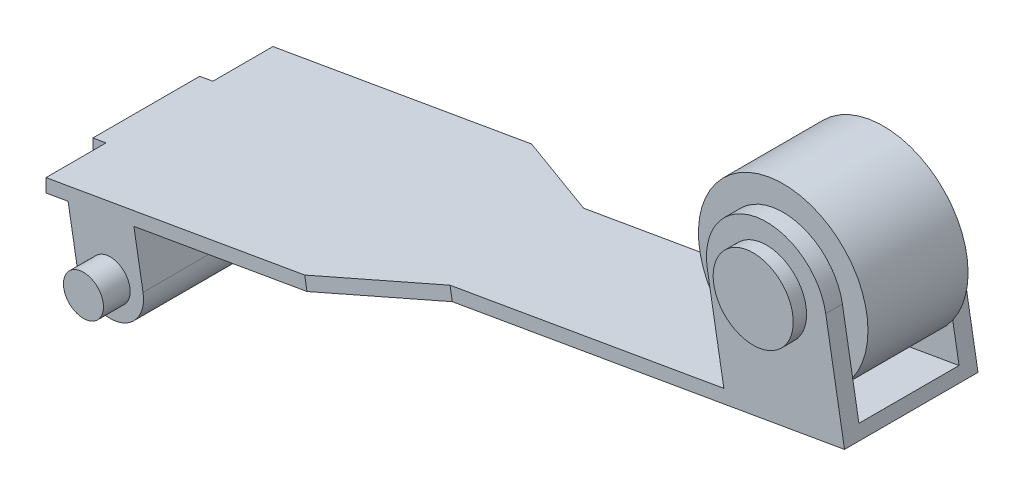
ISO-10303-21;
HEADER;
FILE_DESCRIPTION(('STEP AP214'),'2;1');
FILE_NAME('part.step','',(''),(''),'','','');
FILE_SCHEMA(('AUTOMOTIVE_DESIGN { 1 0 10303 214 1 1 1 1 }'));
ENDSEC;
DATA;
#1=APPLICATION_CONTEXT('core data for automotive mechanical design processes');
#2=APPLICATION_PROTOCOL_DEFINITION('international standard','automotive_design',2000,#1);
#3=PRODUCT_CONTEXT('',#1,'mechanical');
#4=PRODUCT('Part','Part','',(#3));
#5=PRODUCT_RELATED_PRODUCT_CATEGORY('part','',(#4));
#6=PRODUCT_DEFINITION_FORMATION('','',#4);
#7=PRODUCT_DEFINITION_CONTEXT('part definition',#1,'design');
#8=PRODUCT_DEFINITION('design','',#6,#7);
#9=PRODUCT_DEFINITION_SHAPE('','',#8);
#10=(LENGTH_UNIT() NAMED_UNIT(*) SI_UNIT(.MILLI.,.METRE.));
#11=(NAMED_UNIT(*) PLANE_ANGLE_UNIT() SI_UNIT($,.RADIAN.));
#12=(NAMED_UNIT(*) SI_UNIT($,.STERADIAN.) SOLID_ANGLE_UNIT());
#13=UNCERTAINTY_MEASURE_WITH_UNIT(LENGTH_MEASURE(1.E-05),#10,'distance_accuracy_value','');
#14=(GEOMETRIC_REPRESENTATION_CONTEXT(3) GLOBAL_UNCERTAINTY_ASSIGNED_CONTEXT((#13)) GLOBAL_UNIT_ASSIGNED_CONTEXT((#10,
#11,#12)) REPRESENTATION_CONTEXT('',''));
#15=CARTESIAN_POINT('',(0.,0.,0.));
#16=DIRECTION('',(0.,0.,1.));
#17=DIRECTION('',(1.,0.,0.));
#18=AXIS2_PLACEMENT_3D('',#15,#16,#17);
#19=CARTESIAN_POINT('',(0.,0.,-10.5));
#20=DIRECTION('',(0.,0.,1.));
#21=DIRECTION('',(1.,0.,0.));
#22=AXIS2_PLACEMENT_3D('',#19,#20,#21);
#23=PLANE('',#22);
#24=CARTESIAN_POINT('',(0.,0.,-10.5));
#25=DIRECTION('',(0.,0.,-1.));
#26=DIRECTION('',(-1.,0.,0.));
#27=AXIS2_PLACEMENT_3D('',#24,#25,#26);
#28=CIRCLE('',#27,1.5);
#29=CARTESIAN_POINT('',(-1.5,0.,-10.5));
#30=VERTEX_POINT('',#29);
#31=EDGE_CURVE('E20',#30,#30,#28,.F.);
#32=ORIENTED_EDGE('',*,*,#31,.F.);
#33=EDGE_LOOP('',(#32));
#34=FACE_BOUND('',#33,.T.);
#35=ADVANCED_FACE('F17',(#34),#23,.F.);
#36=CARTESIAN_POINT('',(45.6714079047275,20.35,-6.));
#37=DIRECTION('',(0.,0.,-1.));
#38=DIRECTION('',(-1.,0.,0.));
#39=AXIS2_PLACEMENT_3D('',#36,#37,#38);
#40=PLANE('',#39);
#41=CARTESIAN_POINT('',(45.6714079047275,20.35,-6.));
#42=DIRECTION('',(0.,0.,1.));
#43=DIRECTION('',(1.,0.,0.));
#44=AXIS2_PLACEMENT_3D('',#41,#42,#43);
#45=CIRCLE('',#44,1.25);
#46=CARTESIAN_POINT('',(46.9214079047275,20.35,-6.));
#47=VERTEX_POINT('',#46);
#48=EDGE_CURVE('E153',#47,#47,#45,.T.);
#49=ORIENTED_EDGE('',*,*,#48,.F.);
#50=EDGE_LOOP('',(#49));
#51=FACE_BOUND('',#50,.T.);
#52=ADVANCED_FACE('F367',(#51),#40,.T.);
#53=CARTESIAN_POINT('',(45.6714079047275,20.35,6.));
#54=DIRECTION('',(0.,0.,1.));
#55=DIRECTION('',(1.,0.,0.));
#56=AXIS2_PLACEMENT_3D('',#53,#54,#55);
#57=PLANE('',#56);
#58=CARTESIAN_POINT('',(45.6714079047275,20.35,6.));
#59=DIRECTION('',(0.,0.,-1.));
#60=DIRECTION('',(-1.,0.,0.));
#61=AXIS2_PLACEMENT_3D('',#58,#59,#60);
#62=CIRCLE('',#61,3.);
#63=CARTESIAN_POINT('',(42.6714079047275,20.35,6.));
#64=VERTEX_POINT('',#63);
#65=EDGE_CURVE('E351',#64,#64,#62,.T.);
#66=ORIENTED_EDGE('',*,*,#65,.F.);
#67=EDGE_LOOP('',(#66));
#68=FACE_BOUND('',#67,.T.);
#69=ADVANCED_FACE('F369',(#68),#57,.T.);
#70=CARTESIAN_POINT('',(0.,0.,10.5));
#71=DIRECTION('',(0.,0.,1.));
#72=DIRECTION('',(1.,0.,0.));
#73=AXIS2_PLACEMENT_3D('',#70,#71,#72);
#74=PLANE('',#73);
#75=CARTESIAN_POINT('',(0.,0.,10.5));
#76=DIRECTION('',(0.,0.,-1.));
#77=DIRECTION('',(-1.,0.,0.));
#78=AXIS2_PLACEMENT_3D('',#75,#76,#77);
#79=CIRCLE('',#78,1.5);
#80=CARTESIAN_POINT('',(-1.5,0.,10.5));
#81=VERTEX_POINT('',#80);
#82=EDGE_CURVE('E259',#81,#81,#79,.T.);
#83=ORIENTED_EDGE('',*,*,#82,.F.);
#84=EDGE_LOOP('',(#83));
#85=FACE_BOUND('',#84,.T.);
#86=ADVANCED_FACE('F375',(#85),#74,.T.);
#87=CARTESIAN_POINT('',(-4.80556120340105,-3.93121848760159,4.));
#88=DIRECTION('',(-1.,0.,0.));
#89=DIRECTION('',(0.,-1.,0.));
#90=AXIS2_PLACEMENT_3D('',#87,#88,#89);
#91=PLANE('',#90);
#92=DIRECTION('',(0.,1.,0.));
#93=VECTOR('',#92,1.);
#94=CARTESIAN_POINT('',(-4.80556120340105,-3.93121848760159,4.));
#95=LINE('',#94,#93);
#96=CARTESIAN_POINT('',(-4.80556120340105,3.23995160209072,4.));
#97=VERTEX_POINT('',#96);
#98=CARTESIAN_POINT('',(-4.80556120340105,-3.93121848760159,4.));
#99=VERTEX_POINT('',#98);
#100=EDGE_CURVE('E292',#97,#99,#95,.F.);
#101=ORIENTED_EDGE('',*,*,#100,.T.);
#102=DIRECTION('',(0.,0.,1.));
#103=VECTOR('',#102,1.);
#104=CARTESIAN_POINT('',(-4.80556120340105,-3.93121848760159,4.));
#105=LINE('',#104,#103);
#106=CARTESIAN_POINT('',(-4.80556120340105,-3.93121848760159,-4.));
#107=VERTEX_POINT('',#106);
#108=EDGE_CURVE('E269',#99,#107,#105,.F.);
#109=ORIENTED_EDGE('',*,*,#108,.T.);
#110=DIRECTION('',(0.,1.,0.));
#111=VECTOR('',#110,1.);
#112=CARTESIAN_POINT('',(-4.80556120340105,-3.93121848760159,-4.));
#113=LINE('',#112,#111);
#114=CARTESIAN_POINT('',(-4.80556120340105,3.23995160209072,-4.));
#115=VERTEX_POINT('',#114);
#116=EDGE_CURVE('E266',#115,#107,#113,.F.);
#117=ORIENTED_EDGE('',*,*,#116,.F.);
#118=DIRECTION('',(0.,0.,1.));
#119=VECTOR('',#118,1.);
#120=CARTESIAN_POINT('',(-4.80556120340105,3.23995160209072,8.5));
#121=LINE('',#120,#119);
#122=EDGE_CURVE('E255',#115,#97,#121,.T.);
#123=ORIENTED_EDGE('',*,*,#122,.T.);
#124=EDGE_LOOP('',(#101,#109,#117,#123));
#125=FACE_BOUND('',#124,.T.);
#126=ADVANCED_FACE('F500',(#125),#91,.F.);
#127=CARTESIAN_POINT('',(0.,0.,10.5));
#128=DIRECTION('',(0.,0.,-1.));
#129=DIRECTION('',(-1.,0.,0.));
#130=AXIS2_PLACEMENT_3D('',#127,#128,#129);
#131=CYLINDRICAL_SURFACE('',#130,1.5);
#132=CARTESIAN_POINT('',(0.,0.,-8.5));
#133=DIRECTION('',(0.,0.,-1.));
#134=DIRECTION('',(-1.,0.,0.));
#135=AXIS2_PLACEMENT_3D('',#132,#133,#134);
#136=CIRCLE('',#135,1.5);
#137=CARTESIAN_POINT('',(-1.5,0.,-8.5));
#138=VERTEX_POINT('',#137);
#139=EDGE_CURVE('E219',#138,#138,#136,.T.);
#140=ORIENTED_EDGE('',*,*,#139,.T.);
#141=EDGE_LOOP('',(#140));
#142=FACE_BOUND('',#141,.T.);
#143=ORIENTED_EDGE('',*,*,#31,.T.);
#144=EDGE_LOOP('',(#143));
#145=FACE_BOUND('',#144,.T.);
#146=ADVANCED_FACE('F497',(#142,#145),#131,.T.);
#147=CARTESIAN_POINT('',(45.6714079047275,20.35,8.5));
#148=DIRECTION('',(0.,0.,-1.));
#149=DIRECTION('',(-1.,0.,0.));
#150=AXIS2_PLACEMENT_3D('',#147,#148,#149);
#151=CYLINDRICAL_SURFACE('',#150,4.4999999999999);
#152=CARTESIAN_POINT('',(45.6714079047275,20.35,-5.));
#153=DIRECTION('',(0.,0.,-1.));
#154=DIRECTION('',(-1.,0.,0.));
#155=AXIS2_PLACEMENT_3D('',#152,#153,#154);
#156=CIRCLE('',#155,4.4999999999999);
#157=CARTESIAN_POINT('',(50.1049839783841,21.1203266833618,-5.));
#158=VERTEX_POINT('',#157);
#159=CARTESIAN_POINT('',(41.237831831071,19.5796733166382,-5.));
#160=VERTEX_POINT('',#159);
#161=EDGE_CURVE('E147',#158,#160,#156,.F.);
#162=ORIENTED_EDGE('',*,*,#161,.T.);
#163=DIRECTION('',(0.,0.,1.));
#164=VECTOR('',#163,1.);
#165=CARTESIAN_POINT('',(41.237831831071,19.5796733166382,8.5));
#166=LINE('',#165,#164);
#167=CARTESIAN_POINT('',(41.2378318310709,19.5796733166382,-3.75));
#168=VERTEX_POINT('',#167);
#169=EDGE_CURVE('E141',#160,#168,#166,.T.);
#170=ORIENTED_EDGE('',*,*,#169,.T.);
#171=CARTESIAN_POINT('',(45.6714079047275,20.35,-3.75));
#172=DIRECTION('',(0.,0.,-1.));
#173=DIRECTION('',(-1.,0.,0.));
#174=AXIS2_PLACEMENT_3D('',#171,#172,#173);
#175=CIRCLE('',#174,4.4999999999999);
#176=CARTESIAN_POINT('',(50.1049839783841,21.1203266833618,-3.75));
#177=VERTEX_POINT('',#176);
#178=EDGE_CURVE('E145',#177,#168,#175,.F.);
#179=ORIENTED_EDGE('',*,*,#178,.F.);
#180=DIRECTION('',(0.,0.,-1.));
#181=VECTOR('',#180,1.);
#182=CARTESIAN_POINT('',(50.104983978384,21.1203266833618,8.5));
#183=LINE('',#182,#181);
#184=EDGE_CURVE('E215',#177,#158,#183,.T.);
#185=ORIENTED_EDGE('',*,*,#184,.T.);
#186=EDGE_LOOP('',(#162,#170,#179,#185));
#187=FACE_BOUND('',#186,.T.);
#188=ADVANCED_FACE('F143',(#187),#151,.T.);
#189=CARTESIAN_POINT('',(45.6714079047275,20.35,-6.));
#190=DIRECTION('',(0.,0.,1.));
#191=DIRECTION('',(1.,0.,0.));
#192=AXIS2_PLACEMENT_3D('',#189,#190,#191);
#193=CYLINDRICAL_SURFACE('',#192,1.25);
#194=ORIENTED_EDGE('',*,*,#48,.T.);
#195=EDGE_LOOP('',(#194));
#196=FACE_BOUND('',#195,.T.);
#197=CARTESIAN_POINT('',(45.6714079047275,20.35,-5.));
#198=DIRECTION('',(0.,0.,1.));
#199=DIRECTION('',(1.,0.,0.));
#200=AXIS2_PLACEMENT_3D('',#197,#198,#199);
#201=CIRCLE('',#200,1.25);
#202=CARTESIAN_POINT('',(46.9214079047275,20.35,-5.));
#203=VERTEX_POINT('',#202);
#204=EDGE_CURVE('E339',#203,#203,#201,.F.);
#205=ORIENTED_EDGE('',*,*,#204,.T.);
#206=EDGE_LOOP('',(#205));
#207=FACE_BOUND('',#206,.T.);
#208=ADVANCED_FACE('F364',(#196,#207),#193,.T.);
#209=CARTESIAN_POINT('',(41.237831831071,19.5796733166382,8.5));
#210=DIRECTION('',(0.98523912747926,0.171183707413721,0.));
#211=DIRECTION('',(-0.171183707413721,0.98523912747926,0.));
#212=AXIS2_PLACEMENT_3D('',#209,#210,#211);
#213=PLANE('',#212);
#214=DIRECTION('',(-0.171183707413718,0.985239127479261,0.));
#215=VECTOR('',#214,1.);
#216=CARTESIAN_POINT('',(42.4757323147578,12.455,-3.75));
#217=LINE('',#216,#215);
#218=CARTESIAN_POINT('',(42.4757323147578,12.455,-3.75));
#219=VERTEX_POINT('',#218);
#220=CARTESIAN_POINT('',(42.0047749604165,15.1655711161504,-3.75));
#221=VERTEX_POINT('',#220);
#222=EDGE_CURVE('E168',#219,#221,#217,.T.);
#223=ORIENTED_EDGE('',*,*,#222,.T.);
#224=DIRECTION('',(0.171183707413745,-0.985239127479256,0.));
#225=VECTOR('',#224,1.);
#226=CARTESIAN_POINT('',(41.2378318310709,19.5796733166382,-3.75));
#227=LINE('',#226,#225);
#228=EDGE_CURVE('E159',#168,#221,#227,.T.);
#229=ORIENTED_EDGE('',*,*,#228,.F.);
#230=ORIENTED_EDGE('',*,*,#169,.F.);
#231=DIRECTION('',(0.171183707413722,-0.98523912747926,0.));
#232=VECTOR('',#231,1.);
#233=CARTESIAN_POINT('',(41.237831831071,19.5796733166382,-5.));
#234=LINE('',#233,#232);
#235=CARTESIAN_POINT('',(42.4757323147578,12.455,-5.));
#236=VERTEX_POINT('',#235);
#237=EDGE_CURVE('E196',#160,#236,#234,.T.);
#238=ORIENTED_EDGE('',*,*,#237,.T.);
#239=DIRECTION('',(0.,0.,1.));
#240=VECTOR('',#239,1.);
#241=CARTESIAN_POINT('',(42.4757323147578,12.455,8.5));
#242=LINE('',#241,#240);
#243=EDGE_CURVE('E152',#219,#236,#242,.F.);
#244=ORIENTED_EDGE('',*,*,#243,.F.);
#245=EDGE_LOOP('',(#223,#229,#230,#238,#244));
#246=FACE_BOUND('',#245,.T.);
#247=ADVANCED_FACE('F166',(#246),#213,.F.);
#248=CARTESIAN_POINT('',(-7.15438144835975,3.83184787745565,-3.75));
#249=DIRECTION('',(0.,0.,-1.));
#250=DIRECTION('',(-1.,0.,0.));
#251=AXIS2_PLACEMENT_3D('',#248,#249,#250);
#252=PLANE('',#251);
#253=DIRECTION('',(0.171183707413747,-0.985239127479256,0.));
#254=VECTOR('',#253,1.);
#255=CARTESIAN_POINT('',(51.5140681694848,13.0104142392446,-3.75000000000001));
#256=LINE('',#255,#254);
#257=CARTESIAN_POINT('',(50.8719271077297,16.7062244828742,-3.75));
#258=VERTEX_POINT('',#257);
#259=EDGE_CURVE('E162',#258,#177,#256,.F.);
#260=ORIENTED_EDGE('',*,*,#259,.T.);
#261=ORIENTED_EDGE('',*,*,#178,.T.);
#262=ORIENTED_EDGE('',*,*,#228,.T.);
#263=CARTESIAN_POINT('',(45.6714079047275,20.35,-3.75));
#264=DIRECTION('',(0.,0.,1.));
#265=DIRECTION('',(1.,0.,0.));
#266=AXIS2_PLACEMENT_3D('',#263,#264,#265);
#267=CIRCLE('',#266,6.35);
#268=EDGE_CURVE('E163',#258,#221,#267,.T.);
#269=ORIENTED_EDGE('',*,*,#268,.F.);
#270=EDGE_LOOP('',(#260,#261,#262,#269));
#271=FACE_BOUND('',#270,.T.);
#272=ADVANCED_FACE('F158',(#271),#252,.T.);
#273=CARTESIAN_POINT('',(-7.15438144835975,3.83184787745565,3.75));
#274=DIRECTION('',(0.,0.,1.));
#275=DIRECTION('',(1.,0.,0.));
#276=AXIS2_PLACEMENT_3D('',#273,#274,#275);
#277=PLANE('',#276);
#278=DIRECTION('',(0.171183707413747,-0.985239127479256,0.));
#279=VECTOR('',#278,1.);
#280=CARTESIAN_POINT('',(51.5140681694848,13.0104142392446,3.75));
#281=LINE('',#280,#279);
#282=CARTESIAN_POINT('',(50.1049839783841,21.1203266833618,3.75));
#283=VERTEX_POINT('',#282);
#284=CARTESIAN_POINT('',(50.8719271077297,16.7062244828742,3.75));
#285=VERTEX_POINT('',#284);
#286=EDGE_CURVE('E791',#283,#285,#281,.T.);
#287=ORIENTED_EDGE('',*,*,#286,.T.);
#288=CARTESIAN_POINT('',(45.6714079047275,20.35,3.75));
#289=DIRECTION('',(0.,0.,1.));
#290=DIRECTION('',(1.,0.,0.));
#291=AXIS2_PLACEMENT_3D('',#288,#289,#290);
#292=CIRCLE('',#291,6.35);
#293=CARTESIAN_POINT('',(42.0047749604165,15.1655711161504,3.75));
#294=VERTEX_POINT('',#293);
#295=EDGE_CURVE('E359',#294,#285,#292,.F.);
#296=ORIENTED_EDGE('',*,*,#295,.F.);
#297=DIRECTION('',(-0.171183707413721,0.98523912747926,0.));
#298=VECTOR('',#297,1.);
#299=CARTESIAN_POINT('',(41.237831831071,19.5796733166382,3.75));
#300=LINE('',#299,#298);
#301=CARTESIAN_POINT('',(41.237831831071,19.5796733166382,3.75));
#302=VERTEX_POINT('',#301);
#303=EDGE_CURVE('E835',#294,#302,#300,.T.);
#304=ORIENTED_EDGE('',*,*,#303,.T.);
#305=CARTESIAN_POINT('',(45.6714079047275,20.35,3.75));
#306=DIRECTION('',(0.,0.,-1.));
#307=DIRECTION('',(-1.,0.,0.));
#308=AXIS2_PLACEMENT_3D('',#305,#306,#307);
#309=CIRCLE('',#308,4.4999999999999);
#310=EDGE_CURVE('E356',#283,#302,#309,.F.);
#311=ORIENTED_EDGE('',*,*,#310,.F.);
#312=EDGE_LOOP('',(#287,#296,#304,#311));
#313=FACE_BOUND('',#312,.T.);
#314=ADVANCED_FACE('F484',(#313),#277,.T.);
#315=CARTESIAN_POINT('',(45.6714079047275,20.35,-21.7105122421383));
#316=DIRECTION('',(0.,0.,1.));
#317=DIRECTION('',(1.,0.,0.));
#318=AXIS2_PLACEMENT_3D('',#315,#316,#317);
#319=CYLINDRICAL_SURFACE('',#318,6.35);
#320=ORIENTED_EDGE('',*,*,#268,.T.);
#321=CARTESIAN_POINT('',(45.6714079047275,20.35,-3.75));
#322=DIRECTION('',(0.,0.,1.));
#323=DIRECTION('',(1.,0.,0.));
#324=AXIS2_PLACEMENT_3D('',#321,#322,#323);
#325=CIRCLE('',#324,6.35);
#326=EDGE_CURVE('E178',#221,#258,#325,.T.);
#327=ORIENTED_EDGE('',*,*,#326,.T.);
#328=EDGE_LOOP('',(#320,#327));
#329=FACE_BOUND('',#328,.T.);
#330=CARTESIAN_POINT('',(45.6714079047275,20.35,3.75));
#331=DIRECTION('',(0.,0.,1.));
#332=DIRECTION('',(1.,0.,0.));
#333=AXIS2_PLACEMENT_3D('',#330,#331,#332);
#334=CIRCLE('',#333,6.35);
#335=EDGE_CURVE('E333',#285,#294,#334,.F.);
#336=ORIENTED_EDGE('',*,*,#335,.T.);
#337=ORIENTED_EDGE('',*,*,#295,.T.);
#338=EDGE_LOOP('',(#336,#337));
#339=FACE_BOUND('',#338,.T.);
#340=ADVANCED_FACE('F480',(#329,#339),#319,.T.);
#341=CARTESIAN_POINT('',(45.6714079047275,20.35,8.5));
#342=DIRECTION('',(0.,0.,-1.));
#343=DIRECTION('',(-1.,0.,0.));
#344=AXIS2_PLACEMENT_3D('',#341,#342,#343);
#345=CYLINDRICAL_SURFACE('',#344,4.4999999999999);
#346=DIRECTION('',(0.,0.,1.));
#347=VECTOR('',#346,1.);
#348=CARTESIAN_POINT('',(50.1049839783841,21.1203266833619,8.5));
#349=LINE('',#348,#347);
#350=CARTESIAN_POINT('',(50.1049839783841,21.1203266833618,5.));
#351=VERTEX_POINT('',#350);
#352=EDGE_CURVE('E844',#351,#283,#349,.F.);
#353=ORIENTED_EDGE('',*,*,#352,.T.);
#354=ORIENTED_EDGE('',*,*,#310,.T.);
#355=DIRECTION('',(0.,0.,1.));
#356=VECTOR('',#355,1.);
#357=CARTESIAN_POINT('',(41.237831831071,19.5796733166382,8.5));
#358=LINE('',#357,#356);
#359=CARTESIAN_POINT('',(41.237831831071,19.5796733166382,5.));
#360=VERTEX_POINT('',#359);
#361=EDGE_CURVE('E355',#302,#360,#358,.T.);
#362=ORIENTED_EDGE('',*,*,#361,.T.);
#363=CARTESIAN_POINT('',(45.6714079047275,20.35,5.));
#364=DIRECTION('',(0.,0.,-1.));
#365=DIRECTION('',(-1.,0.,0.));
#366=AXIS2_PLACEMENT_3D('',#363,#364,#365);
#367=CIRCLE('',#366,4.4999999999999);
#368=EDGE_CURVE('E328',#360,#351,#367,.T.);
#369=ORIENTED_EDGE('',*,*,#368,.T.);
#370=EDGE_LOOP('',(#353,#354,#362,#369));
#371=FACE_BOUND('',#370,.T.);
#372=ADVANCED_FACE('F476',(#371),#345,.T.);
#373=CARTESIAN_POINT('',(41.237831831071,19.5796733166382,8.5));
#374=DIRECTION('',(0.98523912747926,0.171183707413721,0.));
#375=DIRECTION('',(-0.171183707413721,0.98523912747926,0.));
#376=AXIS2_PLACEMENT_3D('',#373,#374,#375);
#377=PLANE('',#376);
#378=ORIENTED_EDGE('',*,*,#303,.F.);
#379=DIRECTION('',(0.171183707413718,-0.985239127479261,0.));
#380=VECTOR('',#379,1.);
#381=CARTESIAN_POINT('',(42.0047749604165,15.1655711161504,3.75));
#382=LINE('',#381,#380);
#383=CARTESIAN_POINT('',(42.4757323147578,12.455,3.75));
#384=VERTEX_POINT('',#383);
#385=EDGE_CURVE('E332',#294,#384,#382,.T.);
#386=ORIENTED_EDGE('',*,*,#385,.T.);
#387=DIRECTION('',(0.,0.,1.));
#388=VECTOR('',#387,1.);
#389=CARTESIAN_POINT('',(42.4757323147578,12.455,8.5));
#390=LINE('',#389,#388);
#391=CARTESIAN_POINT('',(42.4757323147578,12.455,5.));
#392=VERTEX_POINT('',#391);
#393=EDGE_CURVE('E358',#392,#384,#390,.F.);
#394=ORIENTED_EDGE('',*,*,#393,.F.);
#395=DIRECTION('',(-0.171183707413722,0.98523912747926,0.));
#396=VECTOR('',#395,1.);
#397=CARTESIAN_POINT('',(42.4757323147578,12.455,5.));
#398=LINE('',#397,#396);
#399=EDGE_CURVE('E327',#392,#360,#398,.T.);
#400=ORIENTED_EDGE('',*,*,#399,.T.);
#401=ORIENTED_EDGE('',*,*,#361,.F.);
#402=EDGE_LOOP('',(#378,#386,#394,#400,#401));
#403=FACE_BOUND('',#402,.T.);
#404=ADVANCED_FACE('F472',(#403),#377,.F.);
#405=CARTESIAN_POINT('',(45.6714079047275,20.35,6.));
#406=DIRECTION('',(0.,0.,-1.));
#407=DIRECTION('',(-1.,0.,0.));
#408=AXIS2_PLACEMENT_3D('',#405,#406,#407);
#409=CYLINDRICAL_SURFACE('',#408,3.);
#410=ORIENTED_EDGE('',*,*,#65,.T.);
#411=EDGE_LOOP('',(#410));
#412=FACE_BOUND('',#411,.T.);
#413=CARTESIAN_POINT('',(45.6714079047275,20.35,5.));
#414=DIRECTION('',(0.,0.,-1.));
#415=DIRECTION('',(-1.,0.,0.));
#416=AXIS2_PLACEMENT_3D('',#413,#414,#415);
#417=CIRCLE('',#416,3.);
#418=CARTESIAN_POINT('',(42.6714079047275,20.35,5.));
#419=VERTEX_POINT('',#418);
#420=EDGE_CURVE('E323',#419,#419,#417,.F.);
#421=ORIENTED_EDGE('',*,*,#420,.T.);
#422=EDGE_LOOP('',(#421));
#423=FACE_BOUND('',#422,.T.);
#424=ADVANCED_FACE('F468',(#412,#423),#409,.T.);
#425=CARTESIAN_POINT('',(-2.46309781869814,-0.427959268534373,8.5));
#426=DIRECTION('',(0.985239127479255,0.171183707413749,0.));
#427=DIRECTION('',(-0.171183707413749,0.985239127479255,0.));
#428=AXIS2_PLACEMENT_3D('',#425,#426,#427);
#429=PLANE('',#428);
#430=DIRECTION('',(0.,0.,-1.));
#431=VECTOR('',#430,1.);
#432=CARTESIAN_POINT('',(-2.46309781869814,-0.427959268534373,8.5));
#433=LINE('',#432,#431);
#434=CARTESIAN_POINT('',(-2.46309781869814,-0.42795926853437,8.5));
#435=VERTEX_POINT('',#434);
#436=CARTESIAN_POINT('',(-2.46309781869814,-0.42795926853437,-8.5));
#437=VERTEX_POINT('',#436);
#438=EDGE_CURVE('E354',#435,#437,#433,.T.);
#439=ORIENTED_EDGE('',*,*,#438,.F.);
#440=DIRECTION('',(0.171183707413747,-0.985239127479256,0.));
#441=VECTOR('',#440,1.);
#442=CARTESIAN_POINT('',(-3.15035946923589,3.52754023054582,8.5));
#443=LINE('',#442,#441);
#444=CARTESIAN_POINT('',(-3.15035946923589,3.52754023054582,8.5));
#445=VERTEX_POINT('',#444);
#446=EDGE_CURVE('E322',#445,#435,#443,.T.);
#447=ORIENTED_EDGE('',*,*,#446,.F.);
#448=DIRECTION('',(0.,0.,1.));
#449=VECTOR('',#448,1.);
#450=CARTESIAN_POINT('',(-3.1503594692359,3.52754023054582,8.5));
#451=LINE('',#450,#449);
#452=CARTESIAN_POINT('',(-3.15035946923589,3.52754023054582,-8.5));
#453=VERTEX_POINT('',#452);
#454=EDGE_CURVE('E258',#445,#453,#451,.F.);
#455=ORIENTED_EDGE('',*,*,#454,.T.);
#456=DIRECTION('',(0.171183707413747,-0.985239127479256,0.));
#457=VECTOR('',#456,1.);
#458=CARTESIAN_POINT('',(-3.15035946923589,3.52754023054582,-8.5));
#459=LINE('',#458,#457);
#460=EDGE_CURVE('E236',#453,#437,#459,.T.);
#461=ORIENTED_EDGE('',*,*,#460,.T.);
#462=EDGE_LOOP('',(#439,#447,#455,#461));
#463=FACE_BOUND('',#462,.T.);
#464=ADVANCED_FACE('F464',(#463),#429,.F.);
#465=CARTESIAN_POINT('',(0.,0.,8.5));
#466=DIRECTION('',(0.,0.,-1.));
#467=DIRECTION('',(-1.,0.,0.));
#468=AXIS2_PLACEMENT_3D('',#465,#466,#467);
#469=CYLINDRICAL_SURFACE('',#468,2.5);
#470=CARTESIAN_POINT('',(0.,0.,8.5));
#471=DIRECTION('',(0.,0.,-1.));
#472=DIRECTION('',(-1.,0.,0.));
#473=AXIS2_PLACEMENT_3D('',#470,#471,#472);
#474=CIRCLE('',#473,2.5);
#475=CARTESIAN_POINT('',(2.46309781869814,0.427959268534373,8.5));
#476=VERTEX_POINT('',#475);
#477=EDGE_CURVE('E319',#435,#476,#474,.F.);
#478=ORIENTED_EDGE('',*,*,#477,.F.);
#479=ORIENTED_EDGE('',*,*,#438,.T.);
#480=CARTESIAN_POINT('',(0.,0.,-8.5));
#481=DIRECTION('',(0.,0.,-1.));
#482=DIRECTION('',(-1.,0.,0.));
#483=AXIS2_PLACEMENT_3D('',#480,#481,#482);
#484=CIRCLE('',#483,2.5);
#485=CARTESIAN_POINT('',(2.46309781869814,0.427959268534373,-8.5));
#486=VERTEX_POINT('',#485);
#487=EDGE_CURVE('E345',#437,#486,#484,.F.);
#488=ORIENTED_EDGE('',*,*,#487,.T.);
#489=DIRECTION('',(0.,0.,1.));
#490=VECTOR('',#489,1.);
#491=CARTESIAN_POINT('',(2.46309781869814,0.427959268534372,8.5));
#492=LINE('',#491,#490);
#493=EDGE_CURVE('E808',#486,#476,#492,.T.);
#494=ORIENTED_EDGE('',*,*,#493,.T.);
#495=EDGE_LOOP('',(#478,#479,#488,#494));
#496=FACE_BOUND('',#495,.T.);
#497=ADVANCED_FACE('F460',(#496),#469,.T.);
#498=CARTESIAN_POINT('',(1.77836298904314,4.36891577845138,8.5));
#499=DIRECTION('',(-0.985239127479255,-0.171183707413749,0.));
#500=DIRECTION('',(0.171183707413749,-0.985239127479255,0.));
#501=AXIS2_PLACEMENT_3D('',#498,#499,#500);
#502=PLANE('',#501);
#503=DIRECTION('',(0.,0.,1.));
#504=VECTOR('',#503,1.);
#505=CARTESIAN_POINT('',(1.77836298904314,4.36891577845138,8.5));
#506=LINE('',#505,#504);
#507=CARTESIAN_POINT('',(1.77836298904314,4.36891577845138,-8.5));
#508=VERTEX_POINT('',#507);
#509=CARTESIAN_POINT('',(1.77836298904314,4.36891577845138,8.5));
#510=VERTEX_POINT('',#509);
#511=EDGE_CURVE('E350',#508,#510,#506,.T.);
#512=ORIENTED_EDGE('',*,*,#511,.T.);
#513=DIRECTION('',(-0.17118370741375,0.985239127479255,0.));
#514=VECTOR('',#513,1.);
#515=CARTESIAN_POINT('',(2.46309781869814,0.42795926853437,8.5));
#516=LINE('',#515,#514);
#517=EDGE_CURVE('E321',#476,#510,#516,.T.);
#518=ORIENTED_EDGE('',*,*,#517,.F.);
#519=ORIENTED_EDGE('',*,*,#493,.F.);
#520=DIRECTION('',(-0.17118370741375,0.985239127479255,0.));
#521=VECTOR('',#520,1.);
#522=CARTESIAN_POINT('',(2.46309781869814,0.42795926853437,-8.5));
#523=LINE('',#522,#521);
#524=EDGE_CURVE('E225',#486,#508,#523,.T.);
#525=ORIENTED_EDGE('',*,*,#524,.T.);
#526=EDGE_LOOP('',(#512,#518,#519,#525));
#527=FACE_BOUND('',#526,.T.);
#528=ADVANCED_FACE('F456',(#527),#502,.F.);
#529=CARTESIAN_POINT('',(1.77836298904314,4.36891577845138,8.5));
#530=DIRECTION('',(-0.171183707413749,0.985239127479255,0.));
#531=DIRECTION('',(-0.985239127479255,-0.171183707413749,0.));
#532=AXIS2_PLACEMENT_3D('',#529,#530,#531);
#533=PLANE('',#532);
#534=DIRECTION('',(0.985239127479255,0.171183707413749,0.));
#535=VECTOR('',#534,1.);
#536=CARTESIAN_POINT('',(22.1342373880535,7.90571608416657,-5.));
#537=LINE('',#536,#535);
#538=CARTESIAN_POINT('',(22.1342373880535,7.90571608416657,-5.));
#539=VERTEX_POINT('',#538);
#540=CARTESIAN_POINT('',(51.5140681694848,13.0104142392446,-5.00000000000001));
#541=VERTEX_POINT('',#540);
#542=EDGE_CURVE('E195',#539,#541,#537,.T.);
#543=ORIENTED_EDGE('',*,*,#542,.T.);
#544=DIRECTION('',(0.,0.,1.));
#545=VECTOR('',#544,1.);
#546=CARTESIAN_POINT('',(51.5140681694848,13.0104142392446,8.5));
#547=LINE('',#546,#545);
#548=CARTESIAN_POINT('',(51.5140681694848,13.0104142392446,5.));
#549=VERTEX_POINT('',#548);
#550=EDGE_CURVE('E847',#541,#549,#547,.T.);
#551=ORIENTED_EDGE('',*,*,#550,.T.);
#552=DIRECTION('',(-0.985239127479255,-0.171183707413749,0.));
#553=VECTOR('',#552,1.);
#554=CARTESIAN_POINT('',(51.5140681694848,13.0104142392446,5.));
#555=LINE('',#554,#553);
#556=CARTESIAN_POINT('',(22.1342373880535,7.90571608416657,5.));
#557=VERTEX_POINT('',#556);
#558=EDGE_CURVE('E778',#549,#557,#555,.T.);
#559=ORIENTED_EDGE('',*,*,#558,.T.);
#560=DIRECTION('',(-0.892807086185347,-0.155123789500221,0.422885465331124));
#561=VECTOR('',#560,1.);
#562=CARTESIAN_POINT('',(22.1342373880535,7.90571608416657,4.99999999999999));
#563=LINE('',#562,#561);
#564=CARTESIAN_POINT('',(14.744943931959,6.62183827856345,8.5));
#565=VERTEX_POINT('',#564);
#566=EDGE_CURVE('E771',#557,#565,#563,.T.);
#567=ORIENTED_EDGE('',*,*,#566,.T.);
#568=DIRECTION('',(0.985239127479255,0.171183707413749,0.));
#569=VECTOR('',#568,1.);
#570=CARTESIAN_POINT('',(1.77836298904314,4.36891577845138,8.5));
#571=LINE('',#570,#569);
#572=EDGE_CURVE('E318',#510,#565,#571,.T.);
#573=ORIENTED_EDGE('',*,*,#572,.F.);
#574=ORIENTED_EDGE('',*,*,#511,.F.);
#575=DIRECTION('',(0.985239127479255,0.171183707413749,0.));
#576=VECTOR('',#575,1.);
#577=CARTESIAN_POINT('',(1.77836298904314,4.36891577845138,-8.5));
#578=LINE('',#577,#576);
#579=CARTESIAN_POINT('',(14.744943931959,6.62183827856346,-8.50000000000001));
#580=VERTEX_POINT('',#579);
#581=EDGE_CURVE('E222',#508,#580,#578,.T.);
#582=ORIENTED_EDGE('',*,*,#581,.T.);
#583=DIRECTION('',(0.892807086185347,0.15512378950022,0.422885465331124));
#584=VECTOR('',#583,1.);
#585=CARTESIAN_POINT('',(14.744943931959,6.62183827856346,-8.50000000000001));
#586=LINE('',#585,#584);
#587=EDGE_CURVE('E199',#580,#539,#586,.T.);
#588=ORIENTED_EDGE('',*,*,#587,.T.);
#589=EDGE_LOOP('',(#543,#551,#559,#567,#573,#574,#582,#588));
#590=FACE_BOUND('',#589,.T.);
#591=ADVANCED_FACE('F452',(#590),#533,.F.);
#592=CARTESIAN_POINT('',(0.,0.,10.5));
#593=DIRECTION('',(0.,0.,-1.));
#594=DIRECTION('',(-1.,0.,0.));
#595=AXIS2_PLACEMENT_3D('',#592,#593,#594);
#596=CYLINDRICAL_SURFACE('',#595,1.5);
#597=CARTESIAN_POINT('',(0.,0.,8.5));
#598=DIRECTION('',(0.,0.,-1.));
#599=DIRECTION('',(-1.,0.,0.));
#600=AXIS2_PLACEMENT_3D('',#597,#598,#599);
#601=CIRCLE('',#600,1.5);
#602=CARTESIAN_POINT('',(-1.5,0.,8.5));
#603=VERTEX_POINT('',#602);
#604=EDGE_CURVE('E314',#603,#603,#601,.T.);
#605=ORIENTED_EDGE('',*,*,#604,.F.);
#606=EDGE_LOOP('',(#605));
#607=FACE_BOUND('',#606,.T.);
#608=ORIENTED_EDGE('',*,*,#82,.T.);
#609=EDGE_LOOP('',(#608));
#610=FACE_BOUND('',#609,.T.);
#611=ADVANCED_FACE('F448',(#607,#610),#596,.T.);
#612=CARTESIAN_POINT('',(-4.80556120340105,3.23995160209072,8.5));
#613=DIRECTION('',(-0.171183707413749,0.985239127479255,0.));
#614=DIRECTION('',(-0.985239127479255,-0.171183707413749,0.));
#615=AXIS2_PLACEMENT_3D('',#612,#613,#614);
#616=PLANE('',#615);
#617=ORIENTED_EDGE('',*,*,#454,.F.);
#618=DIRECTION('',(0.985239127479256,0.171183707413746,0.));
#619=VECTOR('',#618,1.);
#620=CARTESIAN_POINT('',(-4.80556120340105,3.23995160209073,8.5));
#621=LINE('',#620,#619);
#622=CARTESIAN_POINT('',(-4.80556120340105,3.23995160209073,8.5));
#623=VERTEX_POINT('',#622);
#624=EDGE_CURVE('E765',#623,#445,#621,.T.);
#625=ORIENTED_EDGE('',*,*,#624,.F.);
#626=DIRECTION('',(0.,0.,-1.));
#627=VECTOR('',#626,1.);
#628=CARTESIAN_POINT('',(-4.80556120340105,3.23995160209072,8.5));
#629=LINE('',#628,#627);
#630=EDGE_CURVE('E311',#623,#97,#629,.T.);
#631=ORIENTED_EDGE('',*,*,#630,.T.);
#632=ORIENTED_EDGE('',*,*,#122,.F.);
#633=DIRECTION('',(0.,0.,-1.));
#634=VECTOR('',#633,1.);
#635=CARTESIAN_POINT('',(-4.80556120340105,3.23995160209072,8.5));
#636=LINE('',#635,#634);
#637=CARTESIAN_POINT('',(-4.80556120340105,3.23995160209073,-8.5));
#638=VERTEX_POINT('',#637);
#639=EDGE_CURVE('E242',#115,#638,#636,.T.);
#640=ORIENTED_EDGE('',*,*,#639,.T.);
#641=DIRECTION('',(0.985239127479256,0.171183707413746,0.));
#642=VECTOR('',#641,1.);
#643=CARTESIAN_POINT('',(-4.80556120340105,3.23995160209073,-8.5));
#644=LINE('',#643,#642);
#645=EDGE_CURVE('E233',#638,#453,#644,.T.);
#646=ORIENTED_EDGE('',*,*,#645,.T.);
#647=EDGE_LOOP('',(#617,#625,#631,#632,#640,#646));
#648=FACE_BOUND('',#647,.T.);
#649=ADVANCED_FACE('F444',(#648),#616,.F.);
#650=CARTESIAN_POINT('',(-4.80556120340105,-3.93121848760159,4.));
#651=DIRECTION('',(0.,0.,-1.));
#652=DIRECTION('',(-1.,0.,0.));
#653=AXIS2_PLACEMENT_3D('',#650,#651,#652);
#654=PLANE('',#653);
#655=DIRECTION('',(0.,1.,0.));
#656=VECTOR('',#655,1.);
#657=CARTESIAN_POINT('',(-4.80556120340105,4.23995160209072,4.));
#658=LINE('',#657,#656);
#659=CARTESIAN_POINT('',(-4.80556120340105,4.23995160209072,4.));
#660=VERTEX_POINT('',#659);
#661=EDGE_CURVE('E306',#97,#660,#658,.T.);
#662=ORIENTED_EDGE('',*,*,#661,.T.);
#663=DIRECTION('',(0.985239127479255,0.171183707413747,0.));
#664=VECTOR('',#663,1.);
#665=CARTESIAN_POINT('',(-5.7908003308803,4.06876789467697,4.));
#666=LINE('',#665,#664);
#667=CARTESIAN_POINT('',(-5.7908003308803,4.06876789467697,4.));
#668=VERTEX_POINT('',#667);
#669=EDGE_CURVE('E296',#668,#660,#666,.T.);
#670=ORIENTED_EDGE('',*,*,#669,.F.);
#671=DIRECTION('',(0.001845109065093,0.99999829778482,0.));
#672=VECTOR('',#671,1.);
#673=CARTESIAN_POINT('',(-5.7908003308803,4.06876789467697,4.));
#674=LINE('',#673,#672);
#675=CARTESIAN_POINT('',(-5.80556120340105,-3.93121848760159,4.));
#676=VERTEX_POINT('',#675);
#677=EDGE_CURVE('E301',#668,#676,#674,.F.);
#678=ORIENTED_EDGE('',*,*,#677,.T.);
#679=DIRECTION('',(1.,0.,0.));
#680=VECTOR('',#679,1.);
#681=CARTESIAN_POINT('',(-5.80556120340105,-3.93121848760159,4.));
#682=LINE('',#681,#680);
#683=EDGE_CURVE('E283',#676,#99,#682,.T.);
#684=ORIENTED_EDGE('',*,*,#683,.T.);
#685=ORIENTED_EDGE('',*,*,#100,.F.);
#686=EDGE_LOOP('',(#662,#670,#678,#684,#685));
#687=FACE_BOUND('',#686,.T.);
#688=ADVANCED_FACE('F440',(#687),#654,.F.);
#689=CARTESIAN_POINT('',(-5.80556120340105,-3.93121848760159,4.));
#690=DIRECTION('',(0.,1.,0.));
#691=DIRECTION('',(0.,0.,1.));
#692=AXIS2_PLACEMENT_3D('',#689,#690,#691);
#693=PLANE('',#692);
#694=ORIENTED_EDGE('',*,*,#108,.F.);
#695=ORIENTED_EDGE('',*,*,#683,.F.);
#696=DIRECTION('',(0.,0.,1.));
#697=VECTOR('',#696,1.);
#698=CARTESIAN_POINT('',(-5.80556120340104,-3.93121848760159,4.));
#699=LINE('',#698,#697);
#700=CARTESIAN_POINT('',(-5.80556120340105,-3.93121848760159,-4.));
#701=VERTEX_POINT('',#700);
#702=EDGE_CURVE('E276',#676,#701,#699,.F.);
#703=ORIENTED_EDGE('',*,*,#702,.T.);
#704=DIRECTION('',(-1.,0.,0.));
#705=VECTOR('',#704,1.);
#706=CARTESIAN_POINT('',(-4.80556120340105,-3.93121848760159,-4.));
#707=LINE('',#706,#705);
#708=EDGE_CURVE('E268',#107,#701,#707,.T.);
#709=ORIENTED_EDGE('',*,*,#708,.F.);
#710=EDGE_LOOP('',(#694,#695,#703,#709));
#711=FACE_BOUND('',#710,.T.);
#712=ADVANCED_FACE('F436',(#711),#693,.F.);
#713=CARTESIAN_POINT('',(-4.80556120340105,-3.93121848760159,-4.));
#714=DIRECTION('',(0.,0.,-1.));
#715=DIRECTION('',(-1.,0.,0.));
#716=AXIS2_PLACEMENT_3D('',#713,#714,#715);
#717=PLANE('',#716);
#718=DIRECTION('',(0.985239127479255,0.171183707413747,0.));
#719=VECTOR('',#718,1.);
#720=CARTESIAN_POINT('',(-5.7908003308803,4.06876789467697,-4.));
#721=LINE('',#720,#719);
#722=CARTESIAN_POINT('',(-5.7908003308803,4.06876789467697,-4.));
#723=VERTEX_POINT('',#722);
#724=CARTESIAN_POINT('',(-4.80556120340105,4.23995160209072,-4.));
#725=VERTEX_POINT('',#724);
#726=EDGE_CURVE('E35',#723,#725,#721,.T.);
#727=ORIENTED_EDGE('',*,*,#726,.T.);
#728=DIRECTION('',(0.,1.,0.));
#729=VECTOR('',#728,1.);
#730=CARTESIAN_POINT('',(-4.80556120340105,4.23995160209072,-4.));
#731=LINE('',#730,#729);
#732=EDGE_CURVE('E247',#725,#115,#731,.F.);
#733=ORIENTED_EDGE('',*,*,#732,.T.);
#734=ORIENTED_EDGE('',*,*,#116,.T.);
#735=ORIENTED_EDGE('',*,*,#708,.T.);
#736=DIRECTION('',(0.001845109065093,0.99999829778482,0.));
#737=VECTOR('',#736,1.);
#738=CARTESIAN_POINT('',(-5.7908003308803,4.06876789467697,-4.));
#739=LINE('',#738,#737);
#740=EDGE_CURVE('E252',#701,#723,#739,.T.);
#741=ORIENTED_EDGE('',*,*,#740,.T.);
#742=EDGE_LOOP('',(#727,#733,#734,#735,#741));
#743=FACE_BOUND('',#742,.T.);
#744=ADVANCED_FACE('F432',(#743),#717,.T.);
#745=CARTESIAN_POINT('',(-4.80556120340105,4.23995160209072,8.5));
#746=DIRECTION('',(1.,0.,0.));
#747=DIRECTION('',(0.,0.,-1.));
#748=AXIS2_PLACEMENT_3D('',#745,#746,#747);
#749=PLANE('',#748);
#750=ORIENTED_EDGE('',*,*,#732,.F.);
#751=DIRECTION('',(0.,0.,1.));
#752=VECTOR('',#751,1.);
#753=CARTESIAN_POINT('',(-4.80556120340105,4.23995160209072,8.5));
#754=LINE('',#753,#752);
#755=CARTESIAN_POINT('',(-4.80556120340105,4.23995160209072,-8.5));
#756=VERTEX_POINT('',#755);
#757=EDGE_CURVE('E230',#725,#756,#754,.F.);
#758=ORIENTED_EDGE('',*,*,#757,.T.);
#759=DIRECTION('',(0.,1.,0.));
#760=VECTOR('',#759,1.);
#761=CARTESIAN_POINT('',(-4.80556120340105,20.35,-8.5));
#762=LINE('',#761,#760);
#763=EDGE_CURVE('E237',#756,#638,#762,.F.);
#764=ORIENTED_EDGE('',*,*,#763,.T.);
#765=ORIENTED_EDGE('',*,*,#639,.F.);
#766=EDGE_LOOP('',(#750,#758,#764,#765));
#767=FACE_BOUND('',#766,.T.);
#768=ADVANCED_FACE('F428',(#767),#749,.F.);
#769=CARTESIAN_POINT('',(45.6714079047275,20.35,-8.5));
#770=DIRECTION('',(0.,0.,1.));
#771=DIRECTION('',(1.,0.,0.));
#772=AXIS2_PLACEMENT_3D('',#769,#770,#771);
#773=PLANE('',#772);
#774=ORIENTED_EDGE('',*,*,#139,.F.);
#775=EDGE_LOOP('',(#774));
#776=FACE_BOUND('',#775,.T.);
#777=DIRECTION('',(0.171183707413745,-0.985239127479256,0.));
#778=VECTOR('',#777,1.);
#779=CARTESIAN_POINT('',(14.5737602245453,7.60707740604268,-8.5));
#780=LINE('',#779,#778);
#781=CARTESIAN_POINT('',(14.5737602245453,7.60707740604268,-8.5));
#782=VERTEX_POINT('',#781);
#783=EDGE_CURVE('E202',#782,#580,#780,.T.);
#784=ORIENTED_EDGE('',*,*,#783,.T.);
#785=ORIENTED_EDGE('',*,*,#581,.F.);
#786=ORIENTED_EDGE('',*,*,#524,.F.);
#787=ORIENTED_EDGE('',*,*,#487,.F.);
#788=ORIENTED_EDGE('',*,*,#460,.F.);
#789=ORIENTED_EDGE('',*,*,#645,.F.);
#790=ORIENTED_EDGE('',*,*,#763,.F.);
#791=DIRECTION('',(0.985239127479256,0.171183707413747,0.));
#792=VECTOR('',#791,1.);
#793=CARTESIAN_POINT('',(-4.80556120340105,4.23995160209072,-8.50000000000001));
#794=LINE('',#793,#792);
#795=EDGE_CURVE('E212',#756,#782,#794,.T.);
#796=ORIENTED_EDGE('',*,*,#795,.T.);
#797=EDGE_LOOP('',(#784,#785,#786,#787,#788,#789,#790,#796));
#798=FACE_BOUND('',#797,.T.);
#799=ADVANCED_FACE('F424',(#776,#798),#773,.F.);
#800=CARTESIAN_POINT('',(24.7501755624502,-7.15018312155088,-5.));
#801=DIRECTION('',(-0.416643306886496,-0.0723911017667694,0.906183139995265));
#802=DIRECTION('',(0.908566926734202,0.,0.41773932020432));
#803=AXIS2_PLACEMENT_3D('',#800,#801,#802);
#804=PLANE('',#803);
#805=ORIENTED_EDGE('',*,*,#587,.F.);
#806=ORIENTED_EDGE('',*,*,#783,.F.);
#807=DIRECTION('',(0.892807086185348,0.15512378950022,0.422885465331122));
#808=VECTOR('',#807,1.);
#809=CARTESIAN_POINT('',(14.5737602245453,7.60707740604268,-8.50000000000001));
#810=LINE('',#809,#808);
#811=CARTESIAN_POINT('',(21.9630536806397,8.89095521164579,-5.));
#812=VERTEX_POINT('',#811);
#813=EDGE_CURVE('E207',#782,#812,#810,.T.);
#814=ORIENTED_EDGE('',*,*,#813,.T.);
#815=DIRECTION('',(0.171183707413763,-0.985239127479253,0.));
#816=VECTOR('',#815,1.);
#817=CARTESIAN_POINT('',(21.9630536806397,8.89095521164579,-5.));
#818=LINE('',#817,#816);
#819=EDGE_CURVE('E192',#812,#539,#818,.T.);
#820=ORIENTED_EDGE('',*,*,#819,.T.);
#821=EDGE_LOOP('',(#805,#806,#814,#820));
#822=FACE_BOUND('',#821,.T.);
#823=ADVANCED_FACE('F420',(#822),#804,.F.);
#824=CARTESIAN_POINT('',(54.1300063438817,-2.04548496647294,-5.));
#825=DIRECTION('',(0.,0.,1.));
#826=DIRECTION('',(1.,0.,0.));
#827=AXIS2_PLACEMENT_3D('',#824,#825,#826);
#828=PLANE('',#827);
#829=ORIENTED_EDGE('',*,*,#204,.F.);
#830=EDGE_LOOP('',(#829));
#831=FACE_BOUND('',#830,.T.);
#832=ORIENTED_EDGE('',*,*,#542,.F.);
#833=ORIENTED_EDGE('',*,*,#819,.F.);
#834=DIRECTION('',(0.985239127479256,0.171183707413747,0.));
#835=VECTOR('',#834,1.);
#836=CARTESIAN_POINT('',(-4.80556120340105,4.23995160209072,-5.00000000000001));
#837=LINE('',#836,#835);
#838=EDGE_CURVE('E187',#812,#236,#837,.T.);
#839=ORIENTED_EDGE('',*,*,#838,.T.);
#840=ORIENTED_EDGE('',*,*,#237,.F.);
#841=ORIENTED_EDGE('',*,*,#161,.F.);
#842=DIRECTION('',(0.171183707413747,-0.985239127479256,0.));
#843=VECTOR('',#842,1.);
#844=CARTESIAN_POINT('',(51.5140681694848,13.0104142392446,-5.00000000000001));
#845=LINE('',#844,#843);
#846=EDGE_CURVE('E182',#158,#541,#845,.T.);
#847=ORIENTED_EDGE('',*,*,#846,.T.);
#848=EDGE_LOOP('',(#832,#833,#839,#840,#841,#847));
#849=FACE_BOUND('',#848,.T.);
#850=ADVANCED_FACE('F416',(#831,#849),#828,.F.);
#851=CARTESIAN_POINT('',(-7.15438144835975,3.83184787745565,-3.75));
#852=DIRECTION('',(0.,0.,-1.));
#853=DIRECTION('',(-1.,0.,0.));
#854=AXIS2_PLACEMENT_3D('',#851,#852,#853);
#855=PLANE('',#854);
#856=ORIENTED_EDGE('',*,*,#326,.F.);
#857=ORIENTED_EDGE('',*,*,#222,.F.);
#858=DIRECTION('',(0.985239127479256,0.171183707413747,0.));
#859=VECTOR('',#858,1.);
#860=CARTESIAN_POINT('',(-4.80556120340105,4.23995160209072,-3.75000000000001));
#861=LINE('',#860,#859);
#862=CARTESIAN_POINT('',(51.3428844620711,13.9956533667237,-3.75000000000001));
#863=VERTEX_POINT('',#862);
#864=EDGE_CURVE('E183',#219,#863,#861,.T.);
#865=ORIENTED_EDGE('',*,*,#864,.T.);
#866=DIRECTION('',(0.171183707413747,-0.985239127479256,0.));
#867=VECTOR('',#866,1.);
#868=CARTESIAN_POINT('',(51.5140681694848,13.0104142392446,-3.75000000000001));
#869=LINE('',#868,#867);
#870=EDGE_CURVE('E175',#863,#258,#869,.F.);
#871=ORIENTED_EDGE('',*,*,#870,.T.);
#872=EDGE_LOOP('',(#856,#857,#865,#871));
#873=FACE_BOUND('',#872,.T.);
#874=ADVANCED_FACE('F412',(#873),#855,.F.);
#875=CARTESIAN_POINT('',(51.5140681694848,13.0104142392446,8.5));
#876=DIRECTION('',(-0.985239127479256,-0.171183707413747,0.));
#877=DIRECTION('',(0.171183707413747,-0.985239127479256,0.));
#878=AXIS2_PLACEMENT_3D('',#875,#876,#877);
#879=PLANE('',#878);
#880=DIRECTION('',(-0.171183707413748,0.985239127479255,0.));
#881=VECTOR('',#880,1.);
#882=CARTESIAN_POINT('',(51.3428844620711,13.9956533667237,3.75));
#883=LINE('',#882,#881);
#884=CARTESIAN_POINT('',(51.3428844620711,13.9956533667237,3.75));
#885=VERTEX_POINT('',#884);
#886=EDGE_CURVE('E336',#885,#285,#883,.T.);
#887=ORIENTED_EDGE('',*,*,#886,.T.);
#888=ORIENTED_EDGE('',*,*,#286,.F.);
#889=ORIENTED_EDGE('',*,*,#352,.F.);
#890=DIRECTION('',(0.171183707413744,-0.985239127479256,0.));
#891=VECTOR('',#890,1.);
#892=CARTESIAN_POINT('',(50.1049839783841,21.1203266833619,5.));
#893=LINE('',#892,#891);
#894=EDGE_CURVE('E331',#351,#549,#893,.T.);
#895=ORIENTED_EDGE('',*,*,#894,.T.);
#896=ORIENTED_EDGE('',*,*,#550,.F.);
#897=ORIENTED_EDGE('',*,*,#846,.F.);
#898=ORIENTED_EDGE('',*,*,#184,.F.);
#899=ORIENTED_EDGE('',*,*,#259,.F.);
#900=ORIENTED_EDGE('',*,*,#870,.F.);
#901=DIRECTION('',(0.,0.,1.));
#902=VECTOR('',#901,1.);
#903=CARTESIAN_POINT('',(51.3428844620711,13.9956533667237,8.5));
#904=LINE('',#903,#902);
#905=EDGE_CURVE('E186',#863,#885,#904,.T.);
#906=ORIENTED_EDGE('',*,*,#905,.T.);
#907=EDGE_LOOP('',(#887,#888,#889,#895,#896,#897,#898,#899,#900,#906));
#908=FACE_BOUND('',#907,.T.);
#909=ADVANCED_FACE('F408',(#908),#879,.F.);
#910=CARTESIAN_POINT('',(-7.15438144835975,3.83184787745565,3.75));
#911=DIRECTION('',(0.,0.,1.));
#912=DIRECTION('',(1.,0.,0.));
#913=AXIS2_PLACEMENT_3D('',#910,#911,#912);
#914=PLANE('',#913);
#915=ORIENTED_EDGE('',*,*,#335,.F.);
#916=ORIENTED_EDGE('',*,*,#886,.F.);
#917=DIRECTION('',(0.985239127479256,0.171183707413747,0.));
#918=VECTOR('',#917,1.);
#919=CARTESIAN_POINT('',(-4.80556120340105,4.23995160209072,3.75));
#920=LINE('',#919,#918);
#921=EDGE_CURVE('E841',#885,#384,#920,.F.);
#922=ORIENTED_EDGE('',*,*,#921,.T.);
#923=ORIENTED_EDGE('',*,*,#385,.F.);
#924=EDGE_LOOP('',(#915,#916,#922,#923));
#925=FACE_BOUND('',#924,.T.);
#926=ADVANCED_FACE('F404',(#925),#914,.F.);
#927=CARTESIAN_POINT('',(54.1300063438817,-2.04548496647294,5.));
#928=DIRECTION('',(0.,0.,-1.));
#929=DIRECTION('',(-1.,0.,0.));
#930=AXIS2_PLACEMENT_3D('',#927,#928,#929);
#931=PLANE('',#930);
#932=ORIENTED_EDGE('',*,*,#420,.F.);
#933=EDGE_LOOP('',(#932));
#934=FACE_BOUND('',#933,.T.);
#935=DIRECTION('',(0.985239127479256,0.171183707413747,0.));
#936=VECTOR('',#935,1.);
#937=CARTESIAN_POINT('',(-4.80556120340105,4.23995160209072,5.));
#938=LINE('',#937,#936);
#939=CARTESIAN_POINT('',(21.9630536806397,8.89095521164578,5.));
#940=VERTEX_POINT('',#939);
#941=EDGE_CURVE('E760',#392,#940,#938,.F.);
#942=ORIENTED_EDGE('',*,*,#941,.T.);
#943=DIRECTION('',(0.171183707413762,-0.985239127479253,0.));
#944=VECTOR('',#943,1.);
#945=CARTESIAN_POINT('',(21.9630536806397,8.89095521164579,5.));
#946=LINE('',#945,#944);
#947=EDGE_CURVE('E326',#940,#557,#946,.T.);
#948=ORIENTED_EDGE('',*,*,#947,.T.);
#949=ORIENTED_EDGE('',*,*,#558,.F.);
#950=ORIENTED_EDGE('',*,*,#894,.F.);
#951=ORIENTED_EDGE('',*,*,#368,.F.);
#952=ORIENTED_EDGE('',*,*,#399,.F.);
#953=EDGE_LOOP('',(#942,#948,#949,#950,#951,#952));
#954=FACE_BOUND('',#953,.T.);
#955=ADVANCED_FACE('F400',(#934,#954),#931,.F.);
#956=CARTESIAN_POINT('',(24.7501755624502,-7.15018312155088,5.));
#957=DIRECTION('',(-0.416643306886496,-0.0723911017667694,-0.906183139995265));
#958=DIRECTION('',(-0.908566926734202,0.,0.41773932020432));
#959=AXIS2_PLACEMENT_3D('',#956,#957,#958);
#960=PLANE('',#959);
#961=ORIENTED_EDGE('',*,*,#566,.F.);
#962=ORIENTED_EDGE('',*,*,#947,.F.);
#963=DIRECTION('',(-0.892807086185348,-0.15512378950022,0.422885465331123));
#964=VECTOR('',#963,1.);
#965=CARTESIAN_POINT('',(21.9630536806397,8.89095521164579,5.));
#966=LINE('',#965,#964);
#967=CARTESIAN_POINT('',(14.5737602245453,7.60707740604268,8.5));
#968=VERTEX_POINT('',#967);
#969=EDGE_CURVE('E755',#940,#968,#966,.T.);
#970=ORIENTED_EDGE('',*,*,#969,.T.);
#971=DIRECTION('',(-0.171183707413742,0.985239127479256,0.));
#972=VECTOR('',#971,1.);
#973=CARTESIAN_POINT('',(14.744943931959,6.62183827856345,8.5));
#974=LINE('',#973,#972);
#975=EDGE_CURVE('E768',#565,#968,#974,.T.);
#976=ORIENTED_EDGE('',*,*,#975,.F.);
#977=EDGE_LOOP('',(#961,#962,#970,#976));
#978=FACE_BOUND('',#977,.T.);
#979=ADVANCED_FACE('F396',(#978),#960,.F.);
#980=CARTESIAN_POINT('',(45.6714079047275,20.35,8.5));
#981=DIRECTION('',(0.,0.,1.));
#982=DIRECTION('',(1.,0.,0.));
#983=AXIS2_PLACEMENT_3D('',#980,#981,#982);
#984=PLANE('',#983);
#985=ORIENTED_EDGE('',*,*,#604,.T.);
#986=EDGE_LOOP('',(#985));
#987=FACE_BOUND('',#986,.T.);
#988=ORIENTED_EDGE('',*,*,#517,.T.);
#989=ORIENTED_EDGE('',*,*,#572,.T.);
#990=ORIENTED_EDGE('',*,*,#975,.T.);
#991=DIRECTION('',(0.985239127479256,0.171183707413747,0.));
#992=VECTOR('',#991,1.);
#993=CARTESIAN_POINT('',(-4.80556120340105,4.23995160209072,8.5));
#994=LINE('',#993,#992);
#995=CARTESIAN_POINT('',(-4.80556120340105,4.23995160209072,8.5));
#996=VERTEX_POINT('',#995);
#997=EDGE_CURVE('E753',#968,#996,#994,.F.);
#998=ORIENTED_EDGE('',*,*,#997,.T.);
#999=DIRECTION('',(0.,1.,0.));
#1000=VECTOR('',#999,1.);
#1001=CARTESIAN_POINT('',(-4.80556120340105,4.23995160209072,8.5));
#1002=LINE('',#1001,#1000);
#1003=EDGE_CURVE('E317',#996,#623,#1002,.F.);
#1004=ORIENTED_EDGE('',*,*,#1003,.T.);
#1005=ORIENTED_EDGE('',*,*,#624,.T.);
#1006=ORIENTED_EDGE('',*,*,#446,.T.);
#1007=ORIENTED_EDGE('',*,*,#477,.T.);
#1008=EDGE_LOOP('',(#988,#989,#990,#998,#1004,#1005,#1006,#1007));
#1009=FACE_BOUND('',#1008,.T.);
#1010=ADVANCED_FACE('F392',(#987,#1009),#984,.T.);
#1011=CARTESIAN_POINT('',(-4.80556120340105,4.23995160209072,8.5));
#1012=DIRECTION('',(1.,0.,0.));
#1013=DIRECTION('',(0.,0.,-1.));
#1014=AXIS2_PLACEMENT_3D('',#1011,#1012,#1013);
#1015=PLANE('',#1014);
#1016=ORIENTED_EDGE('',*,*,#630,.F.);
#1017=ORIENTED_EDGE('',*,*,#1003,.F.);
#1018=DIRECTION('',(0.,0.,1.));
#1019=VECTOR('',#1018,1.);
#1020=CARTESIAN_POINT('',(-4.80556120340105,4.23995160209072,8.5));
#1021=LINE('',#1020,#1019);
#1022=EDGE_CURVE('E26',#996,#660,#1021,.F.);
#1023=ORIENTED_EDGE('',*,*,#1022,.T.);
#1024=ORIENTED_EDGE('',*,*,#661,.F.);
#1025=EDGE_LOOP('',(#1016,#1017,#1023,#1024));
#1026=FACE_BOUND('',#1025,.T.);
#1027=ADVANCED_FACE('F386',(#1026),#1015,.F.);
#1028=CARTESIAN_POINT('',(-5.7908003308803,4.06876789467697,4.));
#1029=DIRECTION('',(0.99999829778482,-0.001845109065093,0.));
#1030=DIRECTION('',(0.001845109065093,0.99999829778482,0.));
#1031=AXIS2_PLACEMENT_3D('',#1028,#1029,#1030);
#1032=PLANE('',#1031);
#1033=ORIENTED_EDGE('',*,*,#702,.F.);
#1034=ORIENTED_EDGE('',*,*,#677,.F.);
#1035=DIRECTION('',(0.,0.,1.));
#1036=VECTOR('',#1035,1.);
#1037=CARTESIAN_POINT('',(-5.7908003308803,4.06876789467697,8.5));
#1038=LINE('',#1037,#1036);
#1039=EDGE_CURVE('E11',#668,#723,#1038,.F.);
#1040=ORIENTED_EDGE('',*,*,#1039,.T.);
#1041=ORIENTED_EDGE('',*,*,#740,.F.);
#1042=EDGE_LOOP('',(#1033,#1034,#1040,#1041));
#1043=FACE_BOUND('',#1042,.T.);
#1044=ADVANCED_FACE('F381',(#1043),#1032,.F.);
#1045=CARTESIAN_POINT('',(-4.80556120340105,4.23995160209072,8.5));
#1046=DIRECTION('',(0.171183707413747,-0.985239127479256,0.));
#1047=DIRECTION('',(0.985239127479256,0.171183707413747,0.));
#1048=AXIS2_PLACEMENT_3D('',#1045,#1046,#1047);
#1049=PLANE('',#1048);
#1050=ORIENTED_EDGE('',*,*,#1039,.F.);
#1051=ORIENTED_EDGE('',*,*,#669,.T.);
#1052=ORIENTED_EDGE('',*,*,#1022,.F.);
#1053=ORIENTED_EDGE('',*,*,#997,.F.);
#1054=ORIENTED_EDGE('',*,*,#969,.F.);
#1055=ORIENTED_EDGE('',*,*,#941,.F.);
#1056=ORIENTED_EDGE('',*,*,#393,.T.);
#1057=ORIENTED_EDGE('',*,*,#921,.F.);
#1058=ORIENTED_EDGE('',*,*,#905,.F.);
#1059=ORIENTED_EDGE('',*,*,#864,.F.);
#1060=ORIENTED_EDGE('',*,*,#243,.T.);
#1061=ORIENTED_EDGE('',*,*,#838,.F.);
#1062=ORIENTED_EDGE('',*,*,#813,.F.);
#1063=ORIENTED_EDGE('',*,*,#795,.F.);
#1064=ORIENTED_EDGE('',*,*,#757,.F.);
#1065=ORIENTED_EDGE('',*,*,#726,.F.);
#1066=EDGE_LOOP('',(#1050,#1051,#1052,#1053,#1054,#1055,#1056,#1057,#1058,#1059,#1060,#1061,
#1062,#1063,#1064,#1065));
#1067=FACE_BOUND('',#1066,.T.);
#1068=ADVANCED_FACE('F379',(#1067),#1049,.F.);
#1069=CLOSED_SHELL('',(#35,#52,#69,#86,#126,#146,#188,#208,#247,#272,#314,#340,#372,#404,#424,
#464,#497,#528,#591,#611,#649,#688,#712,#744,#768,#799,#823,#850,#874,#909,#926,#955,#979,#1010,
#1027,#1044,#1068));
#1070=MANIFOLD_SOLID_BREP('B1',#1069);
#1071=ADVANCED_BREP_SHAPE_REPRESENTATION('',(#18,#1070),#14);
#1072=SHAPE_DEFINITION_REPRESENTATION(#9,#1071);
ENDSEC;
END-ISO-10303-21;
